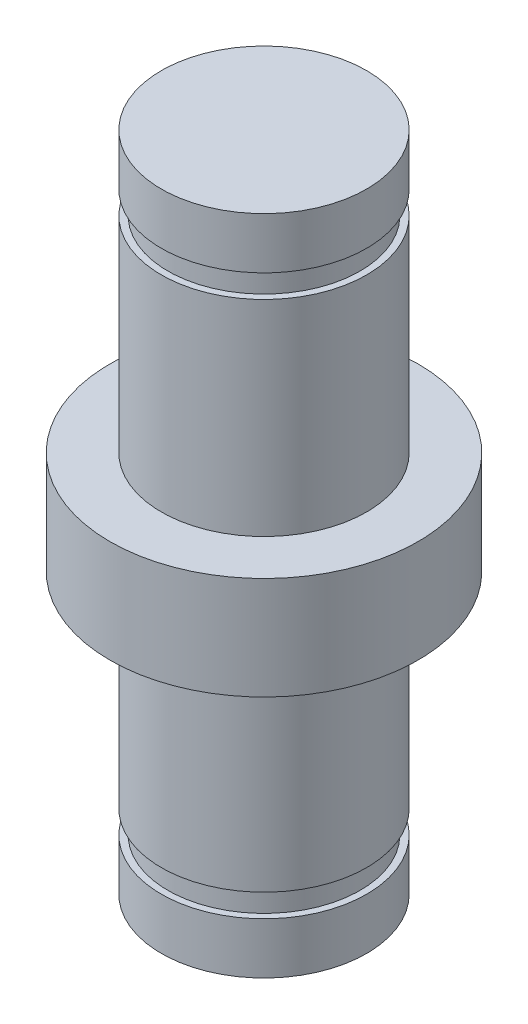
ISO-10303-21;
HEADER;
FILE_DESCRIPTION(('STEP AP214'),'2;1');
FILE_NAME('part.step','',(''),(''),'','','');
FILE_SCHEMA(('AUTOMOTIVE_DESIGN { 1 0 10303 214 1 1 1 1 }'));
ENDSEC;
DATA;
#1=APPLICATION_CONTEXT('core data for automotive mechanical design processes');
#2=APPLICATION_PROTOCOL_DEFINITION('international standard','automotive_design',2000,#1);
#3=PRODUCT_CONTEXT('',#1,'mechanical');
#4=PRODUCT('Part','Part','',(#3));
#5=PRODUCT_RELATED_PRODUCT_CATEGORY('part','',(#4));
#6=PRODUCT_DEFINITION_FORMATION('','',#4);
#7=PRODUCT_DEFINITION_CONTEXT('part definition',#1,'design');
#8=PRODUCT_DEFINITION('design','',#6,#7);
#9=PRODUCT_DEFINITION_SHAPE('','',#8);
#10=(LENGTH_UNIT() NAMED_UNIT(*) SI_UNIT(.MILLI.,.METRE.));
#11=(NAMED_UNIT(*) PLANE_ANGLE_UNIT() SI_UNIT($,.RADIAN.));
#12=(NAMED_UNIT(*) SI_UNIT($,.STERADIAN.) SOLID_ANGLE_UNIT());
#13=UNCERTAINTY_MEASURE_WITH_UNIT(LENGTH_MEASURE(1.E-05),#10,'distance_accuracy_value','');
#14=(GEOMETRIC_REPRESENTATION_CONTEXT(3) GLOBAL_UNCERTAINTY_ASSIGNED_CONTEXT((#13)) GLOBAL_UNIT_ASSIGNED_CONTEXT((#10,
#11,#12)) REPRESENTATION_CONTEXT('',''));
#15=CARTESIAN_POINT('',(0.,0.,0.));
#16=DIRECTION('',(0.,0.,1.));
#17=DIRECTION('',(1.,0.,0.));
#18=AXIS2_PLACEMENT_3D('',#15,#16,#17);
#19=CARTESIAN_POINT('',(0.,40.9448,0.));
#20=DIRECTION('',(0.,1.,0.));
#21=DIRECTION('',(0.,0.,1.));
#22=AXIS2_PLACEMENT_3D('',#19,#20,#21);
#23=PLANE('',#22);
#24=CARTESIAN_POINT('',(0.,40.9448,0.));
#25=DIRECTION('',(0.,-1.,0.));
#26=DIRECTION('',(0.,0.,-1.));
#27=AXIS2_PLACEMENT_3D('',#24,#25,#26);
#28=CIRCLE('',#27,6.35);
#29=CARTESIAN_POINT('',(0.,40.9448,-6.35));
#30=VERTEX_POINT('',#29);
#31=EDGE_CURVE('E10',#30,#30,#28,.T.);
#32=ORIENTED_EDGE('',*,*,#31,.F.);
#33=EDGE_LOOP('',(#32));
#34=FACE_BOUND('',#33,.T.);
#35=ADVANCED_FACE('F31',(#34),#23,.T.);
#36=CARTESIAN_POINT('',(0.,0.,0.));
#37=DIRECTION('',(0.,-1.,0.));
#38=DIRECTION('',(0.,0.,-1.));
#39=AXIS2_PLACEMENT_3D('',#36,#37,#38);
#40=CYLINDRICAL_SURFACE('',#39,6.35);
#41=ORIENTED_EDGE('',*,*,#31,.T.);
#42=EDGE_LOOP('',(#41));
#43=FACE_BOUND('',#42,.T.);
#44=CARTESIAN_POINT('',(0.,37.7698,0.));
#45=DIRECTION('',(0.,-1.,0.));
#46=DIRECTION('',(0.,0.,-1.));
#47=AXIS2_PLACEMENT_3D('',#44,#45,#46);
#48=CIRCLE('',#47,6.35);
#49=CARTESIAN_POINT('',(0.,37.7698,-6.35));
#50=VERTEX_POINT('',#49);
#51=EDGE_CURVE('E37',#50,#50,#48,.T.);
#52=ORIENTED_EDGE('',*,*,#51,.F.);
#53=EDGE_LOOP('',(#52));
#54=FACE_BOUND('',#53,.T.);
#55=ADVANCED_FACE('F97',(#43,#54),#40,.T.);
#56=CARTESIAN_POINT('',(6.35,37.7698,0.));
#57=DIRECTION('',(0.,-1.,0.));
#58=DIRECTION('',(0.,0.,-1.));
#59=AXIS2_PLACEMENT_3D('',#56,#57,#58);
#60=PLANE('',#59);
#61=ORIENTED_EDGE('',*,*,#51,.T.);
#62=EDGE_LOOP('',(#61));
#63=FACE_BOUND('',#62,.T.);
#64=CARTESIAN_POINT('',(0.,37.7698,0.));
#65=DIRECTION('',(0.,-1.,0.));
#66=DIRECTION('',(0.,0.,-1.));
#67=AXIS2_PLACEMENT_3D('',#64,#65,#66);
#68=CIRCLE('',#67,5.9436);
#69=CARTESIAN_POINT('',(0.,37.7698,-5.9436));
#70=VERTEX_POINT('',#69);
#71=EDGE_CURVE('E41',#70,#70,#68,.T.);
#72=ORIENTED_EDGE('',*,*,#71,.F.);
#73=EDGE_LOOP('',(#72));
#74=FACE_BOUND('',#73,.T.);
#75=ADVANCED_FACE('F102',(#63,#74),#60,.T.);
#76=CARTESIAN_POINT('',(0.,0.,0.));
#77=DIRECTION('',(0.,-1.,0.));
#78=DIRECTION('',(0.,0.,-1.));
#79=AXIS2_PLACEMENT_3D('',#76,#77,#78);
#80=CYLINDRICAL_SURFACE('',#79,5.9436);
#81=ORIENTED_EDGE('',*,*,#71,.T.);
#82=EDGE_LOOP('',(#81));
#83=FACE_BOUND('',#82,.T.);
#84=CARTESIAN_POINT('',(0.,36.3474,0.));
#85=DIRECTION('',(0.,-1.,0.));
#86=DIRECTION('',(0.,0.,-1.));
#87=AXIS2_PLACEMENT_3D('',#84,#85,#86);
#88=CIRCLE('',#87,5.9436);
#89=CARTESIAN_POINT('',(0.,36.3474,-5.9436));
#90=VERTEX_POINT('',#89);
#91=EDGE_CURVE('E45',#90,#90,#88,.T.);
#92=ORIENTED_EDGE('',*,*,#91,.F.);
#93=EDGE_LOOP('',(#92));
#94=FACE_BOUND('',#93,.T.);
#95=ADVANCED_FACE('F106',(#83,#94),#80,.T.);
#96=CARTESIAN_POINT('',(5.9436,36.3474,0.));
#97=DIRECTION('',(0.,1.,0.));
#98=DIRECTION('',(0.,0.,1.));
#99=AXIS2_PLACEMENT_3D('',#96,#97,#98);
#100=PLANE('',#99);
#101=ORIENTED_EDGE('',*,*,#91,.T.);
#102=EDGE_LOOP('',(#101));
#103=FACE_BOUND('',#102,.T.);
#104=CARTESIAN_POINT('',(0.,36.3474,0.));
#105=DIRECTION('',(0.,-1.,0.));
#106=DIRECTION('',(0.,0.,-1.));
#107=AXIS2_PLACEMENT_3D('',#104,#105,#106);
#108=CIRCLE('',#107,6.35);
#109=CARTESIAN_POINT('',(0.,36.3474,-6.35));
#110=VERTEX_POINT('',#109);
#111=EDGE_CURVE('E50',#110,#110,#108,.T.);
#112=ORIENTED_EDGE('',*,*,#111,.F.);
#113=EDGE_LOOP('',(#112));
#114=FACE_BOUND('',#113,.T.);
#115=ADVANCED_FACE('F112',(#103,#114),#100,.T.);
#116=CARTESIAN_POINT('',(0.,0.,0.));
#117=DIRECTION('',(0.,-1.,0.));
#118=DIRECTION('',(0.,0.,-1.));
#119=AXIS2_PLACEMENT_3D('',#116,#117,#118);
#120=CYLINDRICAL_SURFACE('',#119,6.35);
#121=ORIENTED_EDGE('',*,*,#111,.T.);
#122=EDGE_LOOP('',(#121));
#123=FACE_BOUND('',#122,.T.);
#124=CARTESIAN_POINT('',(0.,23.6474,0.));
#125=DIRECTION('',(0.,-1.,0.));
#126=DIRECTION('',(0.,0.,-1.));
#127=AXIS2_PLACEMENT_3D('',#124,#125,#126);
#128=CIRCLE('',#127,6.35);
#129=CARTESIAN_POINT('',(0.,23.6474,-6.35));
#130=VERTEX_POINT('',#129);
#131=EDGE_CURVE('E53',#130,#130,#128,.T.);
#132=ORIENTED_EDGE('',*,*,#131,.F.);
#133=EDGE_LOOP('',(#132));
#134=FACE_BOUND('',#133,.T.);
#135=ADVANCED_FACE('F116',(#123,#134),#120,.T.);
#136=CARTESIAN_POINT('',(6.35,23.6474,0.));
#137=DIRECTION('',(0.,1.,0.));
#138=DIRECTION('',(0.,0.,1.));
#139=AXIS2_PLACEMENT_3D('',#136,#137,#138);
#140=PLANE('',#139);
#141=ORIENTED_EDGE('',*,*,#131,.T.);
#142=EDGE_LOOP('',(#141));
#143=FACE_BOUND('',#142,.T.);
#144=CARTESIAN_POINT('',(0.,23.6474,0.));
#145=DIRECTION('',(0.,-1.,0.));
#146=DIRECTION('',(0.,0.,-1.));
#147=AXIS2_PLACEMENT_3D('',#144,#145,#146);
#148=CIRCLE('',#147,9.525);
#149=CARTESIAN_POINT('',(0.,23.6474,-9.525));
#150=VERTEX_POINT('',#149);
#151=EDGE_CURVE('E56',#150,#150,#148,.T.);
#152=ORIENTED_EDGE('',*,*,#151,.F.);
#153=EDGE_LOOP('',(#152));
#154=FACE_BOUND('',#153,.T.);
#155=ADVANCED_FACE('F120',(#143,#154),#140,.T.);
#156=CARTESIAN_POINT('',(0.,0.,0.));
#157=DIRECTION('',(0.,-1.,0.));
#158=DIRECTION('',(0.,0.,-1.));
#159=AXIS2_PLACEMENT_3D('',#156,#157,#158);
#160=CYLINDRICAL_SURFACE('',#159,9.525);
#161=ORIENTED_EDGE('',*,*,#151,.T.);
#162=EDGE_LOOP('',(#161));
#163=FACE_BOUND('',#162,.T.);
#164=CARTESIAN_POINT('',(0.,17.2974,0.));
#165=DIRECTION('',(0.,-1.,0.));
#166=DIRECTION('',(0.,0.,-1.));
#167=AXIS2_PLACEMENT_3D('',#164,#165,#166);
#168=CIRCLE('',#167,9.525);
#169=CARTESIAN_POINT('',(0.,17.2974,-9.525));
#170=VERTEX_POINT('',#169);
#171=EDGE_CURVE('E59',#170,#170,#168,.T.);
#172=ORIENTED_EDGE('',*,*,#171,.F.);
#173=EDGE_LOOP('',(#172));
#174=FACE_BOUND('',#173,.T.);
#175=ADVANCED_FACE('F124',(#163,#174),#160,.T.);
#176=CARTESIAN_POINT('',(9.525,17.2974,0.));
#177=DIRECTION('',(0.,-1.,0.));
#178=DIRECTION('',(0.,0.,-1.));
#179=AXIS2_PLACEMENT_3D('',#176,#177,#178);
#180=PLANE('',#179);
#181=ORIENTED_EDGE('',*,*,#171,.T.);
#182=EDGE_LOOP('',(#181));
#183=FACE_BOUND('',#182,.T.);
#184=CARTESIAN_POINT('',(0.,17.2974,0.));
#185=DIRECTION('',(0.,-1.,0.));
#186=DIRECTION('',(0.,0.,-1.));
#187=AXIS2_PLACEMENT_3D('',#184,#185,#186);
#188=CIRCLE('',#187,6.35);
#189=CARTESIAN_POINT('',(0.,17.2974,-6.35));
#190=VERTEX_POINT('',#189);
#191=EDGE_CURVE('E62',#190,#190,#188,.T.);
#192=ORIENTED_EDGE('',*,*,#191,.F.);
#193=EDGE_LOOP('',(#192));
#194=FACE_BOUND('',#193,.T.);
#195=ADVANCED_FACE('F128',(#183,#194),#180,.T.);
#196=CARTESIAN_POINT('',(0.,0.,0.));
#197=DIRECTION('',(0.,-1.,0.));
#198=DIRECTION('',(0.,0.,-1.));
#199=AXIS2_PLACEMENT_3D('',#196,#197,#198);
#200=CYLINDRICAL_SURFACE('',#199,6.35);
#201=ORIENTED_EDGE('',*,*,#191,.T.);
#202=EDGE_LOOP('',(#201));
#203=FACE_BOUND('',#202,.T.);
#204=CARTESIAN_POINT('',(0.,4.59739999999999,0.));
#205=DIRECTION('',(0.,-1.,0.));
#206=DIRECTION('',(0.,0.,-1.));
#207=AXIS2_PLACEMENT_3D('',#204,#205,#206);
#208=CIRCLE('',#207,6.35);
#209=CARTESIAN_POINT('',(0.,4.59739999999999,-6.35));
#210=VERTEX_POINT('',#209);
#211=EDGE_CURVE('E65',#210,#210,#208,.T.);
#212=ORIENTED_EDGE('',*,*,#211,.F.);
#213=EDGE_LOOP('',(#212));
#214=FACE_BOUND('',#213,.T.);
#215=ADVANCED_FACE('F132',(#203,#214),#200,.T.);
#216=CARTESIAN_POINT('',(6.35,4.59739999999999,0.));
#217=DIRECTION('',(0.,-1.,0.));
#218=DIRECTION('',(0.,0.,-1.));
#219=AXIS2_PLACEMENT_3D('',#216,#217,#218);
#220=PLANE('',#219);
#221=ORIENTED_EDGE('',*,*,#211,.T.);
#222=EDGE_LOOP('',(#221));
#223=FACE_BOUND('',#222,.T.);
#224=CARTESIAN_POINT('',(0.,4.59739999999999,0.));
#225=DIRECTION('',(0.,-1.,0.));
#226=DIRECTION('',(0.,0.,-1.));
#227=AXIS2_PLACEMENT_3D('',#224,#225,#226);
#228=CIRCLE('',#227,5.9436);
#229=CARTESIAN_POINT('',(0.,4.59739999999999,-5.9436));
#230=VERTEX_POINT('',#229);
#231=EDGE_CURVE('E68',#230,#230,#228,.T.);
#232=ORIENTED_EDGE('',*,*,#231,.F.);
#233=EDGE_LOOP('',(#232));
#234=FACE_BOUND('',#233,.T.);
#235=ADVANCED_FACE('F136',(#223,#234),#220,.T.);
#236=CARTESIAN_POINT('',(0.,0.,0.));
#237=DIRECTION('',(0.,-1.,0.));
#238=DIRECTION('',(0.,0.,-1.));
#239=AXIS2_PLACEMENT_3D('',#236,#237,#238);
#240=CYLINDRICAL_SURFACE('',#239,5.9436);
#241=ORIENTED_EDGE('',*,*,#231,.T.);
#242=EDGE_LOOP('',(#241));
#243=FACE_BOUND('',#242,.T.);
#244=CARTESIAN_POINT('',(0.,3.175,0.));
#245=DIRECTION('',(0.,-1.,0.));
#246=DIRECTION('',(0.,0.,-1.));
#247=AXIS2_PLACEMENT_3D('',#244,#245,#246);
#248=CIRCLE('',#247,5.9436);
#249=CARTESIAN_POINT('',(0.,3.175,-5.9436));
#250=VERTEX_POINT('',#249);
#251=EDGE_CURVE('E71',#250,#250,#248,.T.);
#252=ORIENTED_EDGE('',*,*,#251,.F.);
#253=EDGE_LOOP('',(#252));
#254=FACE_BOUND('',#253,.T.);
#255=ADVANCED_FACE('F93',(#243,#254),#240,.T.);
#256=CARTESIAN_POINT('',(5.9436,3.175,0.));
#257=DIRECTION('',(0.,1.,0.));
#258=DIRECTION('',(0.,0.,1.));
#259=AXIS2_PLACEMENT_3D('',#256,#257,#258);
#260=PLANE('',#259);
#261=ORIENTED_EDGE('',*,*,#251,.T.);
#262=EDGE_LOOP('',(#261));
#263=FACE_BOUND('',#262,.T.);
#264=CARTESIAN_POINT('',(0.,3.175,0.));
#265=DIRECTION('',(0.,-1.,0.));
#266=DIRECTION('',(0.,0.,-1.));
#267=AXIS2_PLACEMENT_3D('',#264,#265,#266);
#268=CIRCLE('',#267,6.35);
#269=CARTESIAN_POINT('',(0.,3.175,-6.35));
#270=VERTEX_POINT('',#269);
#271=EDGE_CURVE('E74',#270,#270,#268,.T.);
#272=ORIENTED_EDGE('',*,*,#271,.F.);
#273=EDGE_LOOP('',(#272));
#274=FACE_BOUND('',#273,.T.);
#275=ADVANCED_FACE('F85',(#263,#274),#260,.T.);
#276=CARTESIAN_POINT('',(0.,0.,0.));
#277=DIRECTION('',(0.,-1.,0.));
#278=DIRECTION('',(0.,0.,-1.));
#279=AXIS2_PLACEMENT_3D('',#276,#277,#278);
#280=CYLINDRICAL_SURFACE('',#279,6.35);
#281=ORIENTED_EDGE('',*,*,#271,.T.);
#282=EDGE_LOOP('',(#281));
#283=FACE_BOUND('',#282,.T.);
#284=CARTESIAN_POINT('',(0.,0.,0.));
#285=DIRECTION('',(0.,-1.,0.));
#286=DIRECTION('',(0.,0.,-1.));
#287=AXIS2_PLACEMENT_3D('',#284,#285,#286);
#288=CIRCLE('',#287,6.35);
#289=CARTESIAN_POINT('',(0.,0.,-6.35));
#290=VERTEX_POINT('',#289);
#291=EDGE_CURVE('E77',#290,#290,#288,.T.);
#292=ORIENTED_EDGE('',*,*,#291,.F.);
#293=EDGE_LOOP('',(#292));
#294=FACE_BOUND('',#293,.T.);
#295=ADVANCED_FACE('F83',(#283,#294),#280,.T.);
#296=CARTESIAN_POINT('',(6.35,0.,0.));
#297=DIRECTION('',(0.,-1.,0.));
#298=DIRECTION('',(0.,0.,-1.));
#299=AXIS2_PLACEMENT_3D('',#296,#297,#298);
#300=PLANE('',#299);
#301=ORIENTED_EDGE('',*,*,#291,.T.);
#302=EDGE_LOOP('',(#301));
#303=FACE_BOUND('',#302,.T.);
#304=ADVANCED_FACE('F81',(#303),#300,.T.);
#305=CLOSED_SHELL('',(#35,#55,#75,#95,#115,#135,#155,#175,#195,#215,#235,#255,#275,#295,#304));
#306=MANIFOLD_SOLID_BREP('B2',#305);
#307=ADVANCED_BREP_SHAPE_REPRESENTATION('',(#18,#306),#14);
#308=SHAPE_DEFINITION_REPRESENTATION(#9,#307);
ENDSEC;
END-ISO-10303-21;
